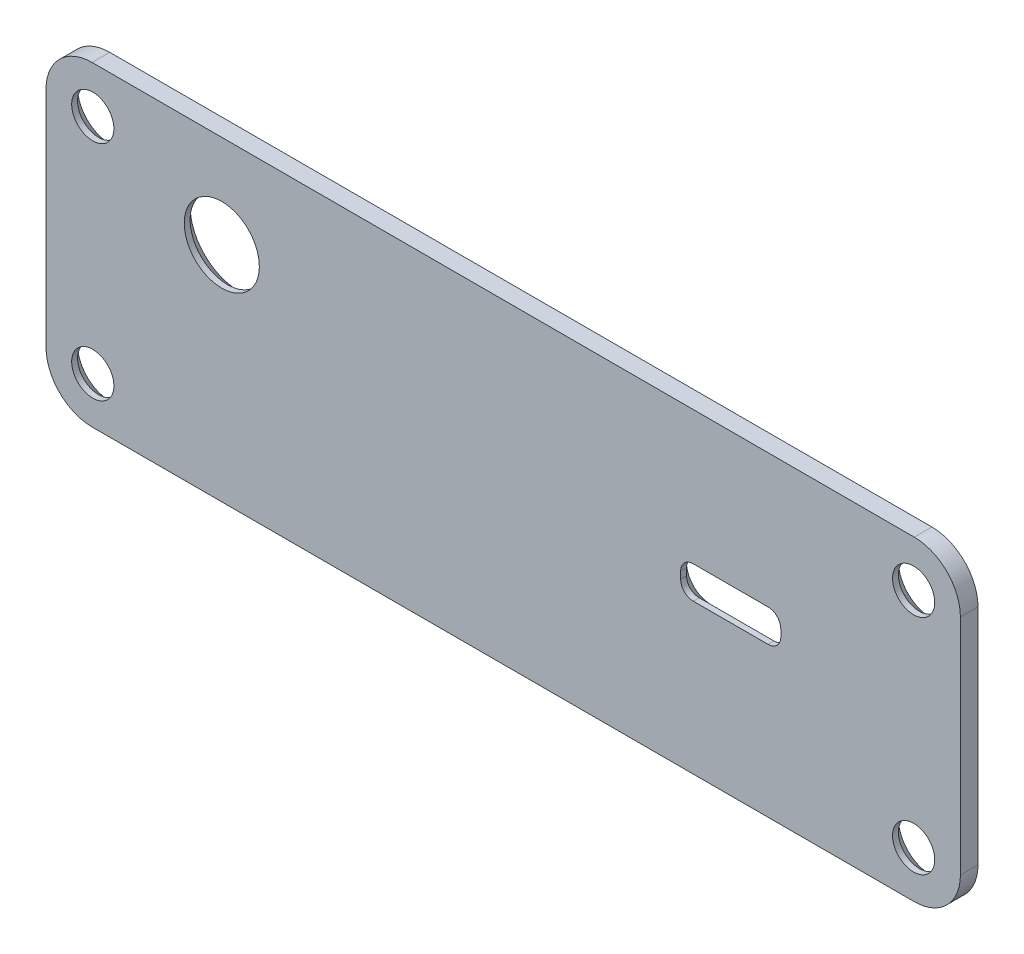
ISO-10303-21;
HEADER;
FILE_DESCRIPTION(('STEP AP214'),'2;1');
FILE_NAME('part.step','',(''),(''),'','','');
FILE_SCHEMA(('AUTOMOTIVE_DESIGN { 1 0 10303 214 1 1 1 1 }'));
ENDSEC;
DATA;
#1=APPLICATION_CONTEXT('core data for automotive mechanical design processes');
#2=APPLICATION_PROTOCOL_DEFINITION('international standard','automotive_design',2000,#1);
#3=PRODUCT_CONTEXT('',#1,'mechanical');
#4=PRODUCT('Part','Part','',(#3));
#5=PRODUCT_RELATED_PRODUCT_CATEGORY('part','',(#4));
#6=PRODUCT_DEFINITION_FORMATION('','',#4);
#7=PRODUCT_DEFINITION_CONTEXT('part definition',#1,'design');
#8=PRODUCT_DEFINITION('design','',#6,#7);
#9=PRODUCT_DEFINITION_SHAPE('','',#8);
#10=(LENGTH_UNIT() NAMED_UNIT(*) SI_UNIT(.MILLI.,.METRE.));
#11=(NAMED_UNIT(*) PLANE_ANGLE_UNIT() SI_UNIT($,.RADIAN.));
#12=(NAMED_UNIT(*) SI_UNIT($,.STERADIAN.) SOLID_ANGLE_UNIT());
#13=UNCERTAINTY_MEASURE_WITH_UNIT(LENGTH_MEASURE(1.E-05),#10,'distance_accuracy_value','');
#14=(GEOMETRIC_REPRESENTATION_CONTEXT(3) GLOBAL_UNCERTAINTY_ASSIGNED_CONTEXT((#13)) GLOBAL_UNIT_ASSIGNED_CONTEXT((#10,
#11,#12)) REPRESENTATION_CONTEXT('',''));
#15=CARTESIAN_POINT('',(0.,0.,0.));
#16=DIRECTION('',(0.,0.,1.));
#17=DIRECTION('',(1.,0.,0.));
#18=AXIS2_PLACEMENT_3D('',#15,#16,#17);
#19=CARTESIAN_POINT('',(3.935,3.935,1.5));
#20=DIRECTION('',(0.,0.,1.));
#21=DIRECTION('',(1.,0.,0.));
#22=AXIS2_PLACEMENT_3D('',#19,#20,#21);
#23=PLANE('',#22);
#24=CARTESIAN_POINT('',(18.1899649689371,18.9844985237211,1.5));
#25=CARTESIAN_POINT('',(18.1899649689371,25.3844985237211,1.5));
#26=CARTESIAN_POINT('',(11.7899649689371,25.3844985237211,1.5));
#27=CARTESIAN_POINT('',(11.7899649689371,18.9844985237211,1.5));
#28=(BOUNDED_CURVE() B_SPLINE_CURVE(3,(#24,#25,#26,#27),.UNSPECIFIED.,.F.,
.F.) B_SPLINE_CURVE_WITH_KNOTS((4,4),(0.,1.),
.UNSPECIFIED.) CURVE() GEOMETRIC_REPRESENTATION_ITEM() RATIONAL_B_SPLINE_CURVE((1.,
0.333333333333333,0.333333333333333,1.)) REPRESENTATION_ITEM(''));
#29=CARTESIAN_POINT('',(18.1899649689371,18.9844985237211,1.5));
#30=VERTEX_POINT('',#29);
#31=CARTESIAN_POINT('',(11.7899649689371,18.9844985237211,1.5));
#32=VERTEX_POINT('',#31);
#33=EDGE_CURVE('E192',#30,#32,#28,.T.);
#34=ORIENTED_EDGE('',*,*,#33,.F.);
#35=CARTESIAN_POINT('',(11.7899649689371,18.9844985237211,1.5));
#36=CARTESIAN_POINT('',(11.7899649689372,12.5844985237211,1.5));
#37=CARTESIAN_POINT('',(18.1899649689372,12.5844985237211,1.5));
#38=CARTESIAN_POINT('',(18.1899649689371,18.9844985237211,1.5));
#39=(BOUNDED_CURVE() B_SPLINE_CURVE(3,(#35,#36,#37,#38),.UNSPECIFIED.,.F.,
.F.) B_SPLINE_CURVE_WITH_KNOTS((4,4),(0.,1.),
.UNSPECIFIED.) CURVE() GEOMETRIC_REPRESENTATION_ITEM() RATIONAL_B_SPLINE_CURVE((1.,
0.333333333333333,0.333333333333333,1.)) REPRESENTATION_ITEM(''));
#40=EDGE_CURVE('E189',#32,#30,#39,.T.);
#41=ORIENTED_EDGE('',*,*,#40,.F.);
#42=EDGE_LOOP('',(#34,#41));
#43=FACE_BOUND('',#42,.T.);
#44=CARTESIAN_POINT('',(62.6599979689345,14.4517998994813,1.5));
#45=CARTESIAN_POINT('',(62.6599980278224,15.0844495776712,1.5));
#46=CARTESIAN_POINT('',(62.2126469944932,15.5318002994689,1.5));
#47=CARTESIAN_POINT('',(61.5799973163036,15.531799800009,1.5));
#48=(BOUNDED_CURVE() B_SPLINE_CURVE(3,(#44,#45,#46,#47),.UNSPECIFIED.,.F.,
.F.) B_SPLINE_CURVE_WITH_KNOTS((4,4),(0.,1.),
.UNSPECIFIED.) CURVE() GEOMETRIC_REPRESENTATION_ITEM() RATIONAL_B_SPLINE_CURVE((1.,
0.804737646104183,0.804737646104183,1.)) REPRESENTATION_ITEM(''));
#49=CARTESIAN_POINT('',(62.6599979689345,14.4517998994813,1.5));
#50=VERTEX_POINT('',#49);
#51=CARTESIAN_POINT('',(61.5799973163035,15.5317999243303,1.5));
#52=VERTEX_POINT('',#51);
#53=EDGE_CURVE('E249',#50,#52,#48,.T.);
#54=ORIENTED_EDGE('',*,*,#53,.F.);
#55=DIRECTION('',(0.,1.,0.));
#56=VECTOR('',#55,1.);
#57=CARTESIAN_POINT('',(62.6599980933165,14.4517998994813,1.5));
#58=LINE('',#57,#56);
#59=CARTESIAN_POINT('',(62.6599980933165,13.8518003725863,1.5));
#60=VERTEX_POINT('',#59);
#61=EDGE_CURVE('E243',#60,#50,#58,.T.);
#62=ORIENTED_EDGE('',*,*,#61,.F.);
#63=CARTESIAN_POINT('',(61.5799973496366,12.7718002000116,1.5));
#64=CARTESIAN_POINT('',(62.2126471387009,12.7717997200776,1.5));
#65=CARTESIAN_POINT('',(62.659998187184,13.2191505835219,1.5));
#66=CARTESIAN_POINT('',(62.6599979689344,13.8518003725863,1.5));
#67=(BOUNDED_CURVE() B_SPLINE_CURVE(3,(#63,#64,#65,#66),.UNSPECIFIED.,.F.,
.F.) B_SPLINE_CURVE_WITH_KNOTS((4,4),(0.,1.),
.UNSPECIFIED.) CURVE() GEOMETRIC_REPRESENTATION_ITEM() RATIONAL_B_SPLINE_CURVE((1.,
0.804737594006537,0.804737594006537,1.)) REPRESENTATION_ITEM(''));
#68=CARTESIAN_POINT('',(61.5799973496366,12.7718002000116,1.5));
#69=VERTEX_POINT('',#68);
#70=EDGE_CURVE('E238',#69,#60,#67,.T.);
#71=ORIENTED_EDGE('',*,*,#70,.F.);
#72=DIRECTION('',(1.,1.15380036878119E-08,0.));
#73=VECTOR('',#72,1.);
#74=CARTESIAN_POINT('',(61.5799973496365,12.7718000594443,1.5));
#75=LINE('',#74,#73);
#76=CARTESIAN_POINT('',(58.6449981689285,12.7718000255803,1.5));
#77=VERTEX_POINT('',#76);
#78=EDGE_CURVE('E235',#77,#69,#75,.T.);
#79=ORIENTED_EDGE('',*,*,#78,.F.);
#80=DIRECTION('',(0.999999999999328,1.1591000728661E-06,0.));
#81=VECTOR('',#80,1.);
#82=CARTESIAN_POINT('',(58.6449981689285,12.7718000255803,1.5));
#83=LINE('',#82,#81);
#84=CARTESIAN_POINT('',(58.6349981689285,12.7718000139893,1.5));
#85=VERTEX_POINT('',#84);
#86=EDGE_CURVE('E233',#85,#77,#83,.T.);
#87=ORIENTED_EDGE('',*,*,#86,.F.);
#88=DIRECTION('',(1.,-2.03317772194214E-09,0.));
#89=VECTOR('',#88,1.);
#90=CARTESIAN_POINT('',(58.6349981689285,12.7718000139893,1.5));
#91=LINE('',#90,#89);
#92=CARTESIAN_POINT('',(55.1999981618515,12.7718000209732,1.5));
#93=VERTEX_POINT('',#92);
#94=EDGE_CURVE('E228',#93,#85,#91,.T.);
#95=ORIENTED_EDGE('',*,*,#94,.F.);
#96=CARTESIAN_POINT('',(54.1199981689366,13.8518005147202,1.5));
#97=CARTESIAN_POINT('',(54.1199978674269,13.2191509263091,1.5));
#98=CARTESIAN_POINT('',(54.5673485734403,12.7718000041615,1.5));
#99=CARTESIAN_POINT('',(55.1999981618515,12.7718000000112,1.5));
#100=(BOUNDED_CURVE() B_SPLINE_CURVE(3,(#96,#97,#98,#99),.UNSPECIFIED.,.F.,
.F.) B_SPLINE_CURVE_WITH_KNOTS((4,4),(0.,1.),
.UNSPECIFIED.) CURVE() GEOMETRIC_REPRESENTATION_ITEM() RATIONAL_B_SPLINE_CURVE((1.,
0.804737743339047,0.804737743339047,1.)) REPRESENTATION_ITEM(''));
#101=CARTESIAN_POINT('',(54.1199981689366,13.8518005147202,1.5));
#102=VERTEX_POINT('',#101);
#103=EDGE_CURVE('E223',#102,#93,#100,.T.);
#104=ORIENTED_EDGE('',*,*,#103,.F.);
#105=DIRECTION('',(0.,-1.,0.));
#106=VECTOR('',#105,1.);
#107=CARTESIAN_POINT('',(54.1199982172505,13.8518005147202,1.5));
#108=LINE('',#107,#106);
#109=CARTESIAN_POINT('',(54.1199982172505,14.4518003250372,1.5));
#110=VERTEX_POINT('',#109);
#111=EDGE_CURVE('E217',#110,#102,#108,.T.);
#112=ORIENTED_EDGE('',*,*,#111,.F.);
#113=CARTESIAN_POINT('',(55.1999996719505,15.5318000000082,1.5));
#114=CARTESIAN_POINT('',(54.5673497721794,15.5318008804542,1.5));
#115=CARTESIAN_POINT('',(54.1199983593337,15.084450224809,1.5));
#116=CARTESIAN_POINT('',(54.1199981689365,14.4518003250372,1.5));
#117=(BOUNDED_CURVE() B_SPLINE_CURVE(3,(#113,#114,#115,#116),.UNSPECIFIED.,.F.,
.F.) B_SPLINE_CURVE_WITH_KNOTS((4,4),(0.,1.),
.UNSPECIFIED.) CURVE() GEOMETRIC_REPRESENTATION_ITEM() RATIONAL_B_SPLINE_CURVE((1.,
0.804737597037281,0.804737597037281,1.)) REPRESENTATION_ITEM(''));
#118=CARTESIAN_POINT('',(55.1999996719505,15.5317999511812,1.5));
#119=VERTEX_POINT('',#118);
#120=EDGE_CURVE('E209',#119,#110,#117,.T.);
#121=ORIENTED_EDGE('',*,*,#120,.F.);
#122=DIRECTION('',(-1.,4.20861173188431E-09,0.));
#123=VECTOR('',#122,1.);
#124=CARTESIAN_POINT('',(55.1999996719505,15.5317999511812,1.5));
#125=LINE('',#124,#123);
#126=EDGE_CURVE('E254',#52,#119,#125,.T.);
#127=ORIENTED_EDGE('',*,*,#126,.F.);
#128=EDGE_LOOP('',(#54,#62,#71,#79,#87,#95,#104,#112,#121,#127));
#129=FACE_BOUND('',#128,.T.);
#130=CARTESIAN_POINT('',(3.98900000000001,3.962,1.5));
#131=DIRECTION('',(0.,0.,1.));
#132=DIRECTION('',(1.,0.,0.));
#133=AXIS2_PLACEMENT_3D('',#130,#131,#132);
#134=CIRCLE('',#133,1.8);
#135=CARTESIAN_POINT('',(5.78900000000001,3.962,1.5));
#136=VERTEX_POINT('',#135);
#137=EDGE_CURVE('E275',#136,#136,#134,.T.);
#138=ORIENTED_EDGE('',*,*,#137,.F.);
#139=EDGE_LOOP('',(#138));
#140=FACE_BOUND('',#139,.T.);
#141=CARTESIAN_POINT('',(3.98900000000001,22.962,1.5));
#142=DIRECTION('',(0.,0.,1.));
#143=DIRECTION('',(1.,0.,0.));
#144=AXIS2_PLACEMENT_3D('',#141,#142,#143);
#145=CIRCLE('',#144,1.8);
#146=CARTESIAN_POINT('',(5.78900000000001,22.962,1.5));
#147=VERTEX_POINT('',#146);
#148=EDGE_CURVE('E281',#147,#147,#145,.T.);
#149=ORIENTED_EDGE('',*,*,#148,.F.);
#150=EDGE_LOOP('',(#149));
#151=FACE_BOUND('',#150,.T.);
#152=CARTESIAN_POINT('',(3.935,3.935,1.5));
#153=DIRECTION('',(0.,0.,1.));
#154=DIRECTION('',(1.,0.,0.));
#155=AXIS2_PLACEMENT_3D('',#152,#153,#154);
#156=CIRCLE('',#155,3.935);
#157=CARTESIAN_POINT('',(0.,3.935,1.5));
#158=VERTEX_POINT('',#157);
#159=CARTESIAN_POINT('',(3.935,0.,1.5));
#160=VERTEX_POINT('',#159);
#161=EDGE_CURVE('E285',#158,#160,#156,.T.);
#162=ORIENTED_EDGE('',*,*,#161,.T.);
#163=DIRECTION('',(1.,0.,0.));
#164=VECTOR('',#163,1.);
#165=CARTESIAN_POINT('',(3.935,0.,1.5));
#166=LINE('',#165,#164);
#167=CARTESIAN_POINT('',(74.043,0.,1.5));
#168=VERTEX_POINT('',#167);
#169=EDGE_CURVE('E288',#160,#168,#166,.T.);
#170=ORIENTED_EDGE('',*,*,#169,.T.);
#171=CARTESIAN_POINT('',(74.043,3.935,1.5));
#172=DIRECTION('',(0.,0.,1.));
#173=DIRECTION('',(1.,0.,0.));
#174=AXIS2_PLACEMENT_3D('',#171,#172,#173);
#175=CIRCLE('',#174,3.93499999999999);
#176=CARTESIAN_POINT('',(77.978,3.935,1.5));
#177=VERTEX_POINT('',#176);
#178=EDGE_CURVE('E291',#168,#177,#175,.T.);
#179=ORIENTED_EDGE('',*,*,#178,.T.);
#180=DIRECTION('',(0.,1.,0.));
#181=VECTOR('',#180,1.);
#182=CARTESIAN_POINT('',(77.978,3.935,1.5));
#183=LINE('',#182,#181);
#184=CARTESIAN_POINT('',(77.978,22.989,1.5));
#185=VERTEX_POINT('',#184);
#186=EDGE_CURVE('E293',#177,#185,#183,.T.);
#187=ORIENTED_EDGE('',*,*,#186,.T.);
#188=CARTESIAN_POINT('',(74.043,22.989,1.5));
#189=DIRECTION('',(0.,0.,1.));
#190=DIRECTION('',(1.,0.,0.));
#191=AXIS2_PLACEMENT_3D('',#188,#189,#190);
#192=CIRCLE('',#191,3.93499999999999);
#193=CARTESIAN_POINT('',(74.043,26.924,1.5));
#194=VERTEX_POINT('',#193);
#195=EDGE_CURVE('E295',#185,#194,#192,.T.);
#196=ORIENTED_EDGE('',*,*,#195,.T.);
#197=DIRECTION('',(-1.,0.,0.));
#198=VECTOR('',#197,1.);
#199=CARTESIAN_POINT('',(74.043,26.924,1.5));
#200=LINE('',#199,#198);
#201=CARTESIAN_POINT('',(3.935,26.924,1.5));
#202=VERTEX_POINT('',#201);
#203=EDGE_CURVE('E297',#194,#202,#200,.T.);
#204=ORIENTED_EDGE('',*,*,#203,.T.);
#205=CARTESIAN_POINT('',(3.93500000000001,22.989,1.5));
#206=DIRECTION('',(0.,0.,1.));
#207=DIRECTION('',(1.,0.,0.));
#208=AXIS2_PLACEMENT_3D('',#205,#206,#207);
#209=CIRCLE('',#208,3.93499999999999);
#210=CARTESIAN_POINT('',(0.,22.989,1.5));
#211=VERTEX_POINT('',#210);
#212=EDGE_CURVE('E299',#202,#211,#209,.T.);
#213=ORIENTED_EDGE('',*,*,#212,.T.);
#214=DIRECTION('',(0.,-1.,0.));
#215=VECTOR('',#214,1.);
#216=CARTESIAN_POINT('',(0.,22.989,1.5));
#217=LINE('',#216,#215);
#218=EDGE_CURVE('E301',#211,#158,#217,.T.);
#219=ORIENTED_EDGE('',*,*,#218,.T.);
#220=EDGE_LOOP('',(#162,#170,#179,#187,#196,#204,#213,#219));
#221=FACE_BOUND('',#220,.T.);
#222=CARTESIAN_POINT('',(73.989,22.962,1.5));
#223=DIRECTION('',(0.,0.,1.));
#224=DIRECTION('',(1.,0.,0.));
#225=AXIS2_PLACEMENT_3D('',#222,#223,#224);
#226=CIRCLE('',#225,1.79999999999999);
#227=CARTESIAN_POINT('',(75.789,22.962,1.5));
#228=VERTEX_POINT('',#227);
#229=EDGE_CURVE('E278',#228,#228,#226,.T.);
#230=ORIENTED_EDGE('',*,*,#229,.F.);
#231=EDGE_LOOP('',(#230));
#232=FACE_BOUND('',#231,.T.);
#233=CARTESIAN_POINT('',(73.989,3.96199999999999,1.5));
#234=DIRECTION('',(0.,0.,1.));
#235=DIRECTION('',(1.,0.,0.));
#236=AXIS2_PLACEMENT_3D('',#233,#234,#235);
#237=CIRCLE('',#236,1.79999999999999);
#238=CARTESIAN_POINT('',(75.789,3.96199999999999,1.5));
#239=VERTEX_POINT('',#238);
#240=EDGE_CURVE('E194',#239,#239,#237,.T.);
#241=ORIENTED_EDGE('',*,*,#240,.F.);
#242=EDGE_LOOP('',(#241));
#243=FACE_BOUND('',#242,.T.);
#244=ADVANCED_FACE('F37',(#43,#129,#140,#151,#221,#232,#243),#23,.T.);
#245=CARTESIAN_POINT('',(3.935,3.935,0.));
#246=DIRECTION('',(0.,0.,1.));
#247=DIRECTION('',(1.,0.,0.));
#248=AXIS2_PLACEMENT_3D('',#245,#246,#247);
#249=PLANE('',#248);
#250=CARTESIAN_POINT('',(14.9899649689371,18.9844985237211,0.));
#251=DIRECTION('',(0.,0.,1.));
#252=DIRECTION('',(1.,0.,0.));
#253=AXIS2_PLACEMENT_3D('',#250,#251,#252);
#254=CIRCLE('',#253,4.2);
#255=CARTESIAN_POINT('',(19.1899649689371,18.9844985237211,0.));
#256=VERTEX_POINT('',#255);
#257=EDGE_CURVE('E371',#256,#256,#254,.T.);
#258=ORIENTED_EDGE('',*,*,#257,.T.);
#259=EDGE_LOOP('',(#258));
#260=FACE_BOUND('',#259,.T.);
#261=CARTESIAN_POINT('',(61.5799981689345,14.4518000000093,0.));
#262=DIRECTION('',(0.,0.,1.));
#263=DIRECTION('',(1.,0.,0.));
#264=AXIS2_PLACEMENT_3D('',#261,#262,#263);
#265=CIRCLE('',#264,2.07999980000001);
#266=CARTESIAN_POINT('',(63.6599980933165,14.4517998063998,0.));
#267=VERTEX_POINT('',#266);
#268=CARTESIAN_POINT('',(61.5799973205121,16.5317998000091,0.));
#269=VERTEX_POINT('',#268);
#270=EDGE_CURVE('E364',#267,#269,#265,.T.);
#271=ORIENTED_EDGE('',*,*,#270,.T.);
#272=DIRECTION('',(-1.,4.20861173188431E-09,0.));
#273=VECTOR('',#272,1.);
#274=CARTESIAN_POINT('',(3.93500005301504,16.5318001669357,0.));
#275=LINE('',#274,#273);
#276=CARTESIAN_POINT('',(55.1999996761591,16.5318000000087,0.));
#277=VERTEX_POINT('',#276);
#278=EDGE_CURVE('E368',#269,#277,#275,.T.);
#279=ORIENTED_EDGE('',*,*,#278,.T.);
#280=CARTESIAN_POINT('',(55.1999981689365,14.4518000000092,0.));
#281=DIRECTION('',(0.,0.,1.));
#282=DIRECTION('',(1.,0.,0.));
#283=AXIS2_PLACEMENT_3D('',#280,#281,#282);
#284=CIRCLE('',#283,2.08);
#285=CARTESIAN_POINT('',(53.1199982172505,14.4518006259891,0.));
#286=VERTEX_POINT('',#285);
#287=EDGE_CURVE('E366',#277,#286,#284,.T.);
#288=ORIENTED_EDGE('',*,*,#287,.T.);
#289=DIRECTION('',(0.,-1.,0.));
#290=VECTOR('',#289,1.);
#291=CARTESIAN_POINT('',(53.1199982172506,3.93500000000057,0.));
#292=LINE('',#291,#290);
#293=CARTESIAN_POINT('',(53.1199981689365,13.8518005147202,0.));
#294=VERTEX_POINT('',#293);
#295=EDGE_CURVE('E362',#286,#294,#292,.T.);
#296=ORIENTED_EDGE('',*,*,#295,.T.);
#297=CARTESIAN_POINT('',(55.1999981689365,13.8518000000112,0.));
#298=DIRECTION('',(0.,0.,1.));
#299=DIRECTION('',(1.,0.,0.));
#300=AXIS2_PLACEMENT_3D('',#297,#298,#299);
#301=CIRCLE('',#300,2.08000000000001);
#302=CARTESIAN_POINT('',(55.1999981552913,11.7717999858318,0.));
#303=VERTEX_POINT('',#302);
#304=EDGE_CURVE('E358',#294,#303,#301,.T.);
#305=ORIENTED_EDGE('',*,*,#304,.T.);
#306=DIRECTION('',(1.,1.15380036878119E-08,0.));
#307=VECTOR('',#306,1.);
#308=CARTESIAN_POINT('',(3.93499990957898,11.7717993943361,0.));
#309=LINE('',#308,#307);
#310=CARTESIAN_POINT('',(61.5799965910273,11.7718000594443,0.));
#311=VERTEX_POINT('',#310);
#312=EDGE_CURVE('E354',#303,#311,#309,.T.);
#313=ORIENTED_EDGE('',*,*,#312,.T.);
#314=CARTESIAN_POINT('',(61.5799981689345,13.8518000000113,0.));
#315=DIRECTION('',(0.,0.,1.));
#316=DIRECTION('',(1.,0.,0.));
#317=AXIS2_PLACEMENT_3D('',#314,#315,#316);
#318=CIRCLE('',#317,2.0799998);
#319=CARTESIAN_POINT('',(63.6599979689345,13.8518003725863,0.));
#320=VERTEX_POINT('',#319);
#321=EDGE_CURVE('E356',#311,#320,#318,.T.);
#322=ORIENTED_EDGE('',*,*,#321,.T.);
#323=DIRECTION('',(0.,1.,0.));
#324=VECTOR('',#323,1.);
#325=CARTESIAN_POINT('',(63.6599980933165,3.935,0.));
#326=LINE('',#325,#324);
#327=EDGE_CURVE('E360',#320,#267,#326,.T.);
#328=ORIENTED_EDGE('',*,*,#327,.T.);
#329=EDGE_LOOP('',(#271,#279,#288,#296,#305,#313,#322,#328));
#330=FACE_BOUND('',#329,.T.);
#331=CARTESIAN_POINT('',(73.989,22.962,0.));
#332=DIRECTION('',(0.,0.,1.));
#333=DIRECTION('',(1.,0.,0.));
#334=AXIS2_PLACEMENT_3D('',#331,#332,#333);
#335=CIRCLE('',#334,2.80000000000002);
#336=CARTESIAN_POINT('',(76.789,22.962,0.));
#337=VERTEX_POINT('',#336);
#338=EDGE_CURVE('E351',#337,#337,#335,.T.);
#339=ORIENTED_EDGE('',*,*,#338,.T.);
#340=EDGE_LOOP('',(#339));
#341=FACE_BOUND('',#340,.T.);
#342=CARTESIAN_POINT('',(73.989,3.96199999999999,0.));
#343=DIRECTION('',(0.,0.,1.));
#344=DIRECTION('',(1.,0.,0.));
#345=AXIS2_PLACEMENT_3D('',#342,#343,#344);
#346=CIRCLE('',#345,2.80000000000002);
#347=CARTESIAN_POINT('',(76.789,3.96199999999999,0.));
#348=VERTEX_POINT('',#347);
#349=EDGE_CURVE('E348',#348,#348,#346,.T.);
#350=ORIENTED_EDGE('',*,*,#349,.T.);
#351=EDGE_LOOP('',(#350));
#352=FACE_BOUND('',#351,.T.);
#353=CARTESIAN_POINT('',(3.98900000000001,22.962,0.));
#354=DIRECTION('',(0.,0.,1.));
#355=DIRECTION('',(1.,0.,0.));
#356=AXIS2_PLACEMENT_3D('',#353,#354,#355);
#357=CIRCLE('',#356,2.79999999999999);
#358=CARTESIAN_POINT('',(6.789,22.962,0.));
#359=VERTEX_POINT('',#358);
#360=EDGE_CURVE('E345',#359,#359,#357,.T.);
#361=ORIENTED_EDGE('',*,*,#360,.T.);
#362=EDGE_LOOP('',(#361));
#363=FACE_BOUND('',#362,.T.);
#364=CARTESIAN_POINT('',(3.98900000000001,3.962,0.));
#365=DIRECTION('',(0.,0.,1.));
#366=DIRECTION('',(1.,0.,0.));
#367=AXIS2_PLACEMENT_3D('',#364,#365,#366);
#368=CIRCLE('',#367,2.80000000000001);
#369=CARTESIAN_POINT('',(6.78900000000002,3.962,0.));
#370=VERTEX_POINT('',#369);
#371=EDGE_CURVE('E342',#370,#370,#368,.T.);
#372=ORIENTED_EDGE('',*,*,#371,.T.);
#373=EDGE_LOOP('',(#372));
#374=FACE_BOUND('',#373,.T.);
#375=CARTESIAN_POINT('',(3.935,3.935,0.));
#376=DIRECTION('',(0.,0.,1.));
#377=DIRECTION('',(1.,0.,0.));
#378=AXIS2_PLACEMENT_3D('',#375,#376,#377);
#379=CIRCLE('',#378,3.935);
#380=CARTESIAN_POINT('',(0.,3.935,0.));
#381=VERTEX_POINT('',#380);
#382=CARTESIAN_POINT('',(3.935,0.,0.));
#383=VERTEX_POINT('',#382);
#384=EDGE_CURVE('E284',#381,#383,#379,.T.);
#385=ORIENTED_EDGE('',*,*,#384,.F.);
#386=DIRECTION('',(0.,-1.,0.));
#387=VECTOR('',#386,1.);
#388=CARTESIAN_POINT('',(0.,22.989,0.));
#389=LINE('',#388,#387);
#390=CARTESIAN_POINT('',(0.,22.989,0.));
#391=VERTEX_POINT('',#390);
#392=EDGE_CURVE('E289',#391,#381,#389,.T.);
#393=ORIENTED_EDGE('',*,*,#392,.F.);
#394=CARTESIAN_POINT('',(3.93500000000001,22.989,0.));
#395=DIRECTION('',(0.,0.,1.));
#396=DIRECTION('',(1.,0.,0.));
#397=AXIS2_PLACEMENT_3D('',#394,#395,#396);
#398=CIRCLE('',#397,3.93499999999999);
#399=CARTESIAN_POINT('',(3.935,26.924,0.));
#400=VERTEX_POINT('',#399);
#401=EDGE_CURVE('E316',#400,#391,#398,.T.);
#402=ORIENTED_EDGE('',*,*,#401,.F.);
#403=DIRECTION('',(-1.,0.,0.));
#404=VECTOR('',#403,1.);
#405=CARTESIAN_POINT('',(74.043,26.924,0.));
#406=LINE('',#405,#404);
#407=CARTESIAN_POINT('',(74.043,26.924,0.));
#408=VERTEX_POINT('',#407);
#409=EDGE_CURVE('E314',#408,#400,#406,.T.);
#410=ORIENTED_EDGE('',*,*,#409,.F.);
#411=CARTESIAN_POINT('',(74.043,22.989,0.));
#412=DIRECTION('',(0.,0.,1.));
#413=DIRECTION('',(1.,0.,0.));
#414=AXIS2_PLACEMENT_3D('',#411,#412,#413);
#415=CIRCLE('',#414,3.93499999999999);
#416=CARTESIAN_POINT('',(77.978,22.989,0.));
#417=VERTEX_POINT('',#416);
#418=EDGE_CURVE('E312',#417,#408,#415,.T.);
#419=ORIENTED_EDGE('',*,*,#418,.F.);
#420=DIRECTION('',(0.,1.,0.));
#421=VECTOR('',#420,1.);
#422=CARTESIAN_POINT('',(77.978,3.935,0.));
#423=LINE('',#422,#421);
#424=CARTESIAN_POINT('',(77.978,3.935,0.));
#425=VERTEX_POINT('',#424);
#426=EDGE_CURVE('E310',#425,#417,#423,.T.);
#427=ORIENTED_EDGE('',*,*,#426,.F.);
#428=CARTESIAN_POINT('',(74.043,3.935,0.));
#429=DIRECTION('',(0.,0.,1.));
#430=DIRECTION('',(1.,0.,0.));
#431=AXIS2_PLACEMENT_3D('',#428,#429,#430);
#432=CIRCLE('',#431,3.93499999999999);
#433=CARTESIAN_POINT('',(74.043,0.,0.));
#434=VERTEX_POINT('',#433);
#435=EDGE_CURVE('E308',#434,#425,#432,.T.);
#436=ORIENTED_EDGE('',*,*,#435,.F.);
#437=DIRECTION('',(1.,0.,0.));
#438=VECTOR('',#437,1.);
#439=CARTESIAN_POINT('',(3.935,0.,0.));
#440=LINE('',#439,#438);
#441=EDGE_CURVE('E306',#383,#434,#440,.T.);
#442=ORIENTED_EDGE('',*,*,#441,.F.);
#443=EDGE_LOOP('',(#385,#393,#402,#410,#419,#427,#436,#442));
#444=FACE_BOUND('',#443,.T.);
#445=ADVANCED_FACE('F466',(#260,#330,#341,#352,#363,#374,#444),#249,.F.);
#446=CARTESIAN_POINT('',(3.935,3.935,1.5));
#447=DIRECTION('',(0.,0.,-1.));
#448=DIRECTION('',(-1.,0.,0.));
#449=AXIS2_PLACEMENT_3D('',#446,#447,#448);
#450=CYLINDRICAL_SURFACE('',#449,3.935);
#451=ORIENTED_EDGE('',*,*,#384,.T.);
#452=DIRECTION('',(0.,0.,-1.));
#453=VECTOR('',#452,1.);
#454=CARTESIAN_POINT('',(3.935,0.,1.5));
#455=LINE('',#454,#453);
#456=EDGE_CURVE('E339',#160,#383,#455,.T.);
#457=ORIENTED_EDGE('',*,*,#456,.F.);
#458=ORIENTED_EDGE('',*,*,#161,.F.);
#459=DIRECTION('',(0.,0.,-1.));
#460=VECTOR('',#459,1.);
#461=CARTESIAN_POINT('',(0.,3.935,1.5));
#462=LINE('',#461,#460);
#463=EDGE_CURVE('E303',#158,#381,#462,.T.);
#464=ORIENTED_EDGE('',*,*,#463,.T.);
#465=EDGE_LOOP('',(#451,#457,#458,#464));
#466=FACE_BOUND('',#465,.T.);
#467=ADVANCED_FACE('F505',(#466),#450,.T.);
#468=CARTESIAN_POINT('',(3.935,0.,1.5));
#469=DIRECTION('',(0.,1.,0.));
#470=DIRECTION('',(-1.,0.,0.));
#471=AXIS2_PLACEMENT_3D('',#468,#469,#470);
#472=PLANE('',#471);
#473=ORIENTED_EDGE('',*,*,#441,.T.);
#474=DIRECTION('',(0.,0.,-1.));
#475=VECTOR('',#474,1.);
#476=CARTESIAN_POINT('',(74.043,0.,1.5));
#477=LINE('',#476,#475);
#478=EDGE_CURVE('E336',#168,#434,#477,.T.);
#479=ORIENTED_EDGE('',*,*,#478,.F.);
#480=ORIENTED_EDGE('',*,*,#169,.F.);
#481=ORIENTED_EDGE('',*,*,#456,.T.);
#482=EDGE_LOOP('',(#473,#479,#480,#481));
#483=FACE_BOUND('',#482,.T.);
#484=ADVANCED_FACE('F535',(#483),#472,.F.);
#485=CARTESIAN_POINT('',(74.043,3.935,1.5));
#486=DIRECTION('',(0.,0.,-1.));
#487=DIRECTION('',(-1.,0.,0.));
#488=AXIS2_PLACEMENT_3D('',#485,#486,#487);
#489=CYLINDRICAL_SURFACE('',#488,3.93499999999999);
#490=ORIENTED_EDGE('',*,*,#435,.T.);
#491=DIRECTION('',(0.,0.,-1.));
#492=VECTOR('',#491,1.);
#493=CARTESIAN_POINT('',(77.978,3.935,1.5));
#494=LINE('',#493,#492);
#495=EDGE_CURVE('E333',#177,#425,#494,.T.);
#496=ORIENTED_EDGE('',*,*,#495,.F.);
#497=ORIENTED_EDGE('',*,*,#178,.F.);
#498=ORIENTED_EDGE('',*,*,#478,.T.);
#499=EDGE_LOOP('',(#490,#496,#497,#498));
#500=FACE_BOUND('',#499,.T.);
#501=ADVANCED_FACE('F531',(#500),#489,.T.);
#502=CARTESIAN_POINT('',(77.978,3.935,1.5));
#503=DIRECTION('',(-1.,0.,0.));
#504=DIRECTION('',(0.,0.,1.));
#505=AXIS2_PLACEMENT_3D('',#502,#503,#504);
#506=PLANE('',#505);
#507=ORIENTED_EDGE('',*,*,#426,.T.);
#508=DIRECTION('',(0.,0.,-1.));
#509=VECTOR('',#508,1.);
#510=CARTESIAN_POINT('',(77.978,22.989,1.5));
#511=LINE('',#510,#509);
#512=EDGE_CURVE('E330',#185,#417,#511,.T.);
#513=ORIENTED_EDGE('',*,*,#512,.F.);
#514=ORIENTED_EDGE('',*,*,#186,.F.);
#515=ORIENTED_EDGE('',*,*,#495,.T.);
#516=EDGE_LOOP('',(#507,#513,#514,#515));
#517=FACE_BOUND('',#516,.T.);
#518=ADVANCED_FACE('F527',(#517),#506,.F.);
#519=CARTESIAN_POINT('',(74.043,22.989,1.5));
#520=DIRECTION('',(0.,0.,-1.));
#521=DIRECTION('',(-1.,0.,0.));
#522=AXIS2_PLACEMENT_3D('',#519,#520,#521);
#523=CYLINDRICAL_SURFACE('',#522,3.93499999999999);
#524=ORIENTED_EDGE('',*,*,#418,.T.);
#525=DIRECTION('',(0.,0.,-1.));
#526=VECTOR('',#525,1.);
#527=CARTESIAN_POINT('',(74.043,26.924,1.5));
#528=LINE('',#527,#526);
#529=EDGE_CURVE('E327',#194,#408,#528,.T.);
#530=ORIENTED_EDGE('',*,*,#529,.F.);
#531=ORIENTED_EDGE('',*,*,#195,.F.);
#532=ORIENTED_EDGE('',*,*,#512,.T.);
#533=EDGE_LOOP('',(#524,#530,#531,#532));
#534=FACE_BOUND('',#533,.T.);
#535=ADVANCED_FACE('F523',(#534),#523,.T.);
#536=CARTESIAN_POINT('',(74.043,26.924,1.5));
#537=DIRECTION('',(0.,-1.,0.));
#538=DIRECTION('',(0.,0.,-1.));
#539=AXIS2_PLACEMENT_3D('',#536,#537,#538);
#540=PLANE('',#539);
#541=ORIENTED_EDGE('',*,*,#409,.T.);
#542=DIRECTION('',(0.,0.,-1.));
#543=VECTOR('',#542,1.);
#544=CARTESIAN_POINT('',(3.935,26.924,1.5));
#545=LINE('',#544,#543);
#546=EDGE_CURVE('E324',#202,#400,#545,.T.);
#547=ORIENTED_EDGE('',*,*,#546,.F.);
#548=ORIENTED_EDGE('',*,*,#203,.F.);
#549=ORIENTED_EDGE('',*,*,#529,.T.);
#550=EDGE_LOOP('',(#541,#547,#548,#549));
#551=FACE_BOUND('',#550,.T.);
#552=ADVANCED_FACE('F519',(#551),#540,.F.);
#553=CARTESIAN_POINT('',(3.93500000000001,22.989,1.5));
#554=DIRECTION('',(0.,0.,-1.));
#555=DIRECTION('',(-1.,0.,0.));
#556=AXIS2_PLACEMENT_3D('',#553,#554,#555);
#557=CYLINDRICAL_SURFACE('',#556,3.93499999999999);
#558=ORIENTED_EDGE('',*,*,#401,.T.);
#559=DIRECTION('',(0.,0.,-1.));
#560=VECTOR('',#559,1.);
#561=CARTESIAN_POINT('',(0.,22.989,1.5));
#562=LINE('',#561,#560);
#563=EDGE_CURVE('E321',#211,#391,#562,.T.);
#564=ORIENTED_EDGE('',*,*,#563,.F.);
#565=ORIENTED_EDGE('',*,*,#212,.F.);
#566=ORIENTED_EDGE('',*,*,#546,.T.);
#567=EDGE_LOOP('',(#558,#564,#565,#566));
#568=FACE_BOUND('',#567,.T.);
#569=ADVANCED_FACE('F515',(#568),#557,.T.);
#570=CARTESIAN_POINT('',(0.,22.989,1.5));
#571=DIRECTION('',(1.,0.,0.));
#572=DIRECTION('',(0.,1.,0.));
#573=AXIS2_PLACEMENT_3D('',#570,#571,#572);
#574=PLANE('',#573);
#575=ORIENTED_EDGE('',*,*,#392,.T.);
#576=ORIENTED_EDGE('',*,*,#463,.F.);
#577=ORIENTED_EDGE('',*,*,#218,.F.);
#578=ORIENTED_EDGE('',*,*,#563,.T.);
#579=EDGE_LOOP('',(#575,#576,#577,#578));
#580=FACE_BOUND('',#579,.T.);
#581=ADVANCED_FACE('F512',(#580),#574,.F.);
#582=CARTESIAN_POINT('',(3.98900000000001,22.962,1.5));
#583=DIRECTION('',(0.,0.,-1.));
#584=DIRECTION('',(-1.,0.,0.));
#585=AXIS2_PLACEMENT_3D('',#582,#583,#584);
#586=CYLINDRICAL_SURFACE('',#585,1.8);
#587=CARTESIAN_POINT('',(3.98900000000001,22.962,0.99999999999999));
#588=DIRECTION('',(0.,0.,1.));
#589=DIRECTION('',(1.,0.,0.));
#590=AXIS2_PLACEMENT_3D('',#587,#588,#589);
#591=CIRCLE('',#590,1.8);
#592=CARTESIAN_POINT('',(5.78900000000001,22.962,0.99999999999999));
#593=VERTEX_POINT('',#592);
#594=EDGE_CURVE('E47',#593,#593,#591,.F.);
#595=ORIENTED_EDGE('',*,*,#594,.T.);
#596=EDGE_LOOP('',(#595));
#597=FACE_BOUND('',#596,.T.);
#598=ORIENTED_EDGE('',*,*,#148,.T.);
#599=EDGE_LOOP('',(#598));
#600=FACE_BOUND('',#599,.T.);
#601=ADVANCED_FACE('F509',(#597,#600),#586,.F.);
#602=CARTESIAN_POINT('',(73.989,22.962,1.5));
#603=DIRECTION('',(0.,0.,-1.));
#604=DIRECTION('',(-1.,0.,0.));
#605=AXIS2_PLACEMENT_3D('',#602,#603,#604);
#606=CYLINDRICAL_SURFACE('',#605,1.79999999999999);
#607=CARTESIAN_POINT('',(73.989,22.962,1.00000000000002));
#608=DIRECTION('',(0.,0.,1.));
#609=DIRECTION('',(1.,0.,0.));
#610=AXIS2_PLACEMENT_3D('',#607,#608,#609);
#611=CIRCLE('',#610,1.79999999999999);
#612=CARTESIAN_POINT('',(75.789,22.962,1.00000000000002));
#613=VERTEX_POINT('',#612);
#614=EDGE_CURVE('E392',#613,#613,#611,.F.);
#615=ORIENTED_EDGE('',*,*,#614,.T.);
#616=EDGE_LOOP('',(#615));
#617=FACE_BOUND('',#616,.T.);
#618=ORIENTED_EDGE('',*,*,#229,.T.);
#619=EDGE_LOOP('',(#618));
#620=FACE_BOUND('',#619,.T.);
#621=ADVANCED_FACE('F586',(#617,#620),#606,.F.);
#622=CARTESIAN_POINT('',(3.98900000000001,3.962,1.5));
#623=DIRECTION('',(0.,0.,-1.));
#624=DIRECTION('',(-1.,0.,0.));
#625=AXIS2_PLACEMENT_3D('',#622,#623,#624);
#626=CYLINDRICAL_SURFACE('',#625,1.8);
#627=CARTESIAN_POINT('',(3.98900000000001,3.962,1.00000000000001));
#628=DIRECTION('',(0.,0.,1.));
#629=DIRECTION('',(1.,0.,0.));
#630=AXIS2_PLACEMENT_3D('',#627,#628,#629);
#631=CIRCLE('',#630,1.8);
#632=CARTESIAN_POINT('',(5.78900000000001,3.962,1.00000000000001));
#633=VERTEX_POINT('',#632);
#634=EDGE_CURVE('E11',#633,#633,#631,.F.);
#635=ORIENTED_EDGE('',*,*,#634,.T.);
#636=EDGE_LOOP('',(#635));
#637=FACE_BOUND('',#636,.T.);
#638=ORIENTED_EDGE('',*,*,#137,.T.);
#639=EDGE_LOOP('',(#638));
#640=FACE_BOUND('',#639,.T.);
#641=ADVANCED_FACE('F583',(#637,#640),#626,.F.);
#642=CARTESIAN_POINT('',(73.989,3.96199999999999,1.5));
#643=DIRECTION('',(0.,0.,-1.));
#644=DIRECTION('',(-1.,0.,0.));
#645=AXIS2_PLACEMENT_3D('',#642,#643,#644);
#646=CYLINDRICAL_SURFACE('',#645,1.79999999999999);
#647=CARTESIAN_POINT('',(73.989,3.96199999999999,1.00000000000002));
#648=DIRECTION('',(0.,0.,1.));
#649=DIRECTION('',(1.,0.,0.));
#650=AXIS2_PLACEMENT_3D('',#647,#648,#649);
#651=CIRCLE('',#650,1.79999999999999);
#652=CARTESIAN_POINT('',(75.789,3.96199999999999,1.00000000000002));
#653=VERTEX_POINT('',#652);
#654=EDGE_CURVE('E395',#653,#653,#651,.F.);
#655=ORIENTED_EDGE('',*,*,#654,.T.);
#656=EDGE_LOOP('',(#655));
#657=FACE_BOUND('',#656,.T.);
#658=ORIENTED_EDGE('',*,*,#240,.T.);
#659=EDGE_LOOP('',(#658));
#660=FACE_BOUND('',#659,.T.);
#661=ADVANCED_FACE('F580',(#657,#660),#646,.F.);
#662=CARTESIAN_POINT('',(55.1999981689365,14.4518000000092,-8.5));
#663=DIRECTION('',(0.,0.,1.));
#664=DIRECTION('',(1.,0.,0.));
#665=AXIS2_PLACEMENT_3D('',#662,#663,#664);
#666=CYLINDRICAL_SURFACE('',#665,1.07999999999999);
#667=DIRECTION('',(0.,0.,1.));
#668=VECTOR('',#667,1.);
#669=CARTESIAN_POINT('',(54.1199982172505,14.4518003250372,-8.5));
#670=LINE('',#669,#668);
#671=CARTESIAN_POINT('',(54.1199982172505,14.4518003250372,1.00000000000001));
#672=VERTEX_POINT('',#671);
#673=EDGE_CURVE('E259',#672,#110,#670,.T.);
#674=ORIENTED_EDGE('',*,*,#673,.F.);
#675=CARTESIAN_POINT('',(55.1999981689365,14.4518000000092,1.00000000000001));
#676=DIRECTION('',(0.,0.,1.));
#677=DIRECTION('',(1.,0.,0.));
#678=AXIS2_PLACEMENT_3D('',#675,#676,#677);
#679=CIRCLE('',#678,1.07999999999999);
#680=CARTESIAN_POINT('',(55.1999996719505,15.5317999511812,1.00000000000001));
#681=VERTEX_POINT('',#680);
#682=EDGE_CURVE('E380',#672,#681,#679,.F.);
#683=ORIENTED_EDGE('',*,*,#682,.T.);
#684=DIRECTION('',(0.,0.,1.));
#685=VECTOR('',#684,1.);
#686=CARTESIAN_POINT('',(55.1999996719505,15.5317999511812,-8.5));
#687=LINE('',#686,#685);
#688=EDGE_CURVE('E197',#681,#119,#687,.T.);
#689=ORIENTED_EDGE('',*,*,#688,.T.);
#690=ORIENTED_EDGE('',*,*,#120,.T.);
#691=EDGE_LOOP('',(#674,#683,#689,#690));
#692=FACE_BOUND('',#691,.T.);
#693=ADVANCED_FACE('F479',(#692),#666,.F.);
#694=CARTESIAN_POINT('',(55.1999996719505,15.5317999511812,-8.5));
#695=DIRECTION('',(4.20861173188431E-09,1.,0.));
#696=DIRECTION('',(-1.,4.20861173188431E-09,0.));
#697=AXIS2_PLACEMENT_3D('',#694,#695,#696);
#698=PLANE('',#697);
#699=ORIENTED_EDGE('',*,*,#688,.F.);
#700=DIRECTION('',(1.,-4.20861173188431E-09,0.));
#701=VECTOR('',#700,1.);
#702=CARTESIAN_POINT('',(55.1999996719505,15.5317999511812,1.00000000000001));
#703=LINE('',#702,#701);
#704=CARTESIAN_POINT('',(61.5799973163035,15.5317999243303,1.00000000000001));
#705=VERTEX_POINT('',#704);
#706=EDGE_CURVE('E377',#681,#705,#703,.T.);
#707=ORIENTED_EDGE('',*,*,#706,.T.);
#708=DIRECTION('',(0.,0.,1.));
#709=VECTOR('',#708,1.);
#710=CARTESIAN_POINT('',(61.5799973163035,15.5317999243303,-8.5));
#711=LINE('',#710,#709);
#712=EDGE_CURVE('E199',#705,#52,#711,.T.);
#713=ORIENTED_EDGE('',*,*,#712,.T.);
#714=ORIENTED_EDGE('',*,*,#126,.T.);
#715=EDGE_LOOP('',(#699,#707,#713,#714));
#716=FACE_BOUND('',#715,.T.);
#717=ADVANCED_FACE('F482',(#716),#698,.F.);
#718=CARTESIAN_POINT('',(61.5799981689345,14.4518000000093,-8.5));
#719=DIRECTION('',(0.,0.,1.));
#720=DIRECTION('',(1.,0.,0.));
#721=AXIS2_PLACEMENT_3D('',#718,#719,#720);
#722=CYLINDRICAL_SURFACE('',#721,1.07999980000001);
#723=ORIENTED_EDGE('',*,*,#712,.F.);
#724=CARTESIAN_POINT('',(61.5799981689345,14.4518000000093,1.00000000000001));
#725=DIRECTION('',(0.,0.,1.));
#726=DIRECTION('',(1.,0.,0.));
#727=AXIS2_PLACEMENT_3D('',#724,#725,#726);
#728=CIRCLE('',#727,1.07999980000001);
#729=CARTESIAN_POINT('',(62.6599979689345,14.4517998994813,1.00000000000001));
#730=VERTEX_POINT('',#729);
#731=EDGE_CURVE('E382',#705,#730,#728,.F.);
#732=ORIENTED_EDGE('',*,*,#731,.T.);
#733=DIRECTION('',(0.,0.,1.));
#734=VECTOR('',#733,1.);
#735=CARTESIAN_POINT('',(62.6599979689345,14.4517998994813,-8.5));
#736=LINE('',#735,#734);
#737=EDGE_CURVE('E262',#730,#50,#736,.T.);
#738=ORIENTED_EDGE('',*,*,#737,.T.);
#739=ORIENTED_EDGE('',*,*,#53,.T.);
#740=EDGE_LOOP('',(#723,#732,#738,#739));
#741=FACE_BOUND('',#740,.T.);
#742=ADVANCED_FACE('F566',(#741),#722,.F.);
#743=CARTESIAN_POINT('',(62.6599980933165,14.4517998994813,-8.5));
#744=DIRECTION('',(1.,0.,0.));
#745=DIRECTION('',(0.,0.,-1.));
#746=AXIS2_PLACEMENT_3D('',#743,#744,#745);
#747=PLANE('',#746);
#748=ORIENTED_EDGE('',*,*,#737,.F.);
#749=DIRECTION('',(0.,-1.,0.));
#750=VECTOR('',#749,1.);
#751=CARTESIAN_POINT('',(62.6599980933165,14.4517998994813,1.00000000000001));
#752=LINE('',#751,#750);
#753=CARTESIAN_POINT('',(62.6599980933165,13.8518003725863,1.00000000000001));
#754=VERTEX_POINT('',#753);
#755=EDGE_CURVE('E386',#730,#754,#752,.T.);
#756=ORIENTED_EDGE('',*,*,#755,.T.);
#757=DIRECTION('',(0.,0.,1.));
#758=VECTOR('',#757,1.);
#759=CARTESIAN_POINT('',(62.6599980933165,13.8518003725863,-8.5));
#760=LINE('',#759,#758);
#761=EDGE_CURVE('E264',#754,#60,#760,.T.);
#762=ORIENTED_EDGE('',*,*,#761,.T.);
#763=ORIENTED_EDGE('',*,*,#61,.T.);
#764=EDGE_LOOP('',(#748,#756,#762,#763));
#765=FACE_BOUND('',#764,.T.);
#766=ADVANCED_FACE('F453',(#765),#747,.F.);
#767=CARTESIAN_POINT('',(61.5799981689345,13.8518000000113,-8.5));
#768=DIRECTION('',(0.,0.,1.));
#769=DIRECTION('',(1.,0.,0.));
#770=AXIS2_PLACEMENT_3D('',#767,#768,#769);
#771=CYLINDRICAL_SURFACE('',#770,1.0799998);
#772=ORIENTED_EDGE('',*,*,#761,.F.);
#773=CARTESIAN_POINT('',(61.5799981689345,13.8518000000113,1.00000000000001));
#774=DIRECTION('',(0.,0.,1.));
#775=DIRECTION('',(1.,0.,0.));
#776=AXIS2_PLACEMENT_3D('',#773,#774,#775);
#777=CIRCLE('',#776,1.0799998);
#778=CARTESIAN_POINT('',(61.5799973496366,12.7718002000116,1.00000000000001));
#779=VERTEX_POINT('',#778);
#780=EDGE_CURVE('E55',#754,#779,#777,.F.);
#781=ORIENTED_EDGE('',*,*,#780,.T.);
#782=DIRECTION('',(0.,0.,1.));
#783=VECTOR('',#782,1.);
#784=CARTESIAN_POINT('',(61.5799973496366,12.7718002000116,-8.5));
#785=LINE('',#784,#783);
#786=EDGE_CURVE('E266',#779,#69,#785,.T.);
#787=ORIENTED_EDGE('',*,*,#786,.T.);
#788=ORIENTED_EDGE('',*,*,#70,.T.);
#789=EDGE_LOOP('',(#772,#781,#787,#788));
#790=FACE_BOUND('',#789,.T.);
#791=ADVANCED_FACE('F450',(#790),#771,.F.);
#792=CARTESIAN_POINT('',(61.5799973496365,12.7718000594443,-8.5));
#793=DIRECTION('',(1.15380036878119E-08,-1.,0.));
#794=DIRECTION('',(1.,1.15380036878119E-08,0.));
#795=AXIS2_PLACEMENT_3D('',#792,#793,#794);
#796=PLANE('',#795);
#797=ORIENTED_EDGE('',*,*,#786,.F.);
#798=DIRECTION('',(-1.,-1.15380036878119E-08,0.));
#799=VECTOR('',#798,1.);
#800=CARTESIAN_POINT('',(61.5799973496365,12.7718000594443,1.00000000000001));
#801=LINE('',#800,#799);
#802=CARTESIAN_POINT('',(55.1999981618515,12.7718000209732,1.00000000000001));
#803=VERTEX_POINT('',#802);
#804=EDGE_CURVE('E62',#779,#803,#801,.T.);
#805=ORIENTED_EDGE('',*,*,#804,.T.);
#806=DIRECTION('',(0.,0.,1.));
#807=VECTOR('',#806,1.);
#808=CARTESIAN_POINT('',(55.1999981618515,12.7718000209732,-8.5));
#809=LINE('',#808,#807);
#810=EDGE_CURVE('E268',#803,#93,#809,.T.);
#811=ORIENTED_EDGE('',*,*,#810,.T.);
#812=ORIENTED_EDGE('',*,*,#94,.T.);
#813=ORIENTED_EDGE('',*,*,#86,.T.);
#814=ORIENTED_EDGE('',*,*,#78,.T.);
#815=EDGE_LOOP('',(#797,#805,#811,#812,#813,#814));
#816=FACE_BOUND('',#815,.T.);
#817=ADVANCED_FACE('F447',(#816),#796,.F.);
#818=CARTESIAN_POINT('',(55.1999981689365,13.8518000000112,-8.5));
#819=DIRECTION('',(0.,0.,1.));
#820=DIRECTION('',(1.,0.,0.));
#821=AXIS2_PLACEMENT_3D('',#818,#819,#820);
#822=CYLINDRICAL_SURFACE('',#821,1.08);
#823=ORIENTED_EDGE('',*,*,#810,.F.);
#824=CARTESIAN_POINT('',(55.1999981689365,13.8518000000112,1.00000000000001));
#825=DIRECTION('',(0.,0.,1.));
#826=DIRECTION('',(1.,0.,0.));
#827=AXIS2_PLACEMENT_3D('',#824,#825,#826);
#828=CIRCLE('',#827,1.08);
#829=CARTESIAN_POINT('',(54.1199981689366,13.8518005147202,1.00000000000001));
#830=VERTEX_POINT('',#829);
#831=EDGE_CURVE('E388',#803,#830,#828,.F.);
#832=ORIENTED_EDGE('',*,*,#831,.T.);
#833=DIRECTION('',(0.,0.,1.));
#834=VECTOR('',#833,1.);
#835=CARTESIAN_POINT('',(54.1199981689366,13.8518005147202,-8.5));
#836=LINE('',#835,#834);
#837=EDGE_CURVE('E270',#830,#102,#836,.T.);
#838=ORIENTED_EDGE('',*,*,#837,.T.);
#839=ORIENTED_EDGE('',*,*,#103,.T.);
#840=EDGE_LOOP('',(#823,#832,#838,#839));
#841=FACE_BOUND('',#840,.T.);
#842=ADVANCED_FACE('F435',(#841),#822,.F.);
#843=CARTESIAN_POINT('',(54.1199982172505,13.8518005147202,-8.5));
#844=DIRECTION('',(-1.,0.,0.));
#845=DIRECTION('',(0.,-1.,0.));
#846=AXIS2_PLACEMENT_3D('',#843,#844,#845);
#847=PLANE('',#846);
#848=ORIENTED_EDGE('',*,*,#837,.F.);
#849=DIRECTION('',(0.,1.,0.));
#850=VECTOR('',#849,1.);
#851=CARTESIAN_POINT('',(54.1199982172505,13.8518005147202,1.00000000000001));
#852=LINE('',#851,#850);
#853=EDGE_CURVE('E384',#830,#672,#852,.T.);
#854=ORIENTED_EDGE('',*,*,#853,.T.);
#855=ORIENTED_EDGE('',*,*,#673,.T.);
#856=ORIENTED_EDGE('',*,*,#111,.T.);
#857=EDGE_LOOP('',(#848,#854,#855,#856));
#858=FACE_BOUND('',#857,.T.);
#859=ADVANCED_FACE('F437',(#858),#847,.F.);
#860=CARTESIAN_POINT('',(14.9899649689371,18.9844985237211,-8.5));
#861=DIRECTION('',(0.,0.,1.));
#862=DIRECTION('',(1.,0.,0.));
#863=AXIS2_PLACEMENT_3D('',#860,#861,#862);
#864=CYLINDRICAL_SURFACE('',#863,3.2);
#865=CARTESIAN_POINT('',(14.9899649689371,18.9844985237211,1.));
#866=DIRECTION('',(0.,0.,1.));
#867=DIRECTION('',(1.,0.,0.));
#868=AXIS2_PLACEMENT_3D('',#865,#866,#867);
#869=CIRCLE('',#868,3.2);
#870=CARTESIAN_POINT('',(18.1899649689371,18.9844985237211,1.));
#871=VERTEX_POINT('',#870);
#872=EDGE_CURVE('E374',#871,#871,#869,.F.);
#873=ORIENTED_EDGE('',*,*,#872,.T.);
#874=EDGE_LOOP('',(#873));
#875=FACE_BOUND('',#874,.T.);
#876=ORIENTED_EDGE('',*,*,#40,.T.);
#877=ORIENTED_EDGE('',*,*,#33,.T.);
#878=EDGE_LOOP('',(#876,#877));
#879=FACE_BOUND('',#878,.T.);
#880=ADVANCED_FACE('F191',(#875,#879),#864,.F.);
#881=CARTESIAN_POINT('',(14.9899649689371,18.9844985237211,0.));
#882=DIRECTION('',(0.,0.,-1.));
#883=DIRECTION('',(-1.,0.,0.));
#884=AXIS2_PLACEMENT_3D('',#881,#882,#883);
#885=CONICAL_SURFACE('',#884,4.2,0.785398163397447);
#886=ORIENTED_EDGE('',*,*,#872,.F.);
#887=EDGE_LOOP('',(#886));
#888=FACE_BOUND('',#887,.T.);
#889=ORIENTED_EDGE('',*,*,#257,.F.);
#890=EDGE_LOOP('',(#889));
#891=FACE_BOUND('',#890,.T.);
#892=ADVANCED_FACE('F543',(#888,#891),#885,.F.);
#893=CARTESIAN_POINT('',(3.93499990957898,11.7717993943361,0.));
#894=DIRECTION('',(8.15860064900721E-09,-0.707106781186547,0.707106781186548));
#895=DIRECTION('',(1.,1.15380036878119E-08,0.));
#896=AXIS2_PLACEMENT_3D('',#893,#894,#895);
#897=PLANE('',#896);
#898=DIRECTION('',(-4.63874003840251E-09,-0.707106781186548,-0.707106781186547));
#899=VECTOR('',#898,1.);
#900=CARTESIAN_POINT('',(55.1999981618515,12.7717999858318,1.00000000000001));
#901=LINE('',#900,#899);
#902=EDGE_CURVE('E415',#803,#303,#901,.T.);
#903=ORIENTED_EDGE('',*,*,#902,.F.);
#904=ORIENTED_EDGE('',*,*,#804,.F.);
#905=DIRECTION('',(5.36417775661505E-07,0.70710678118645,0.707106781186442));
#906=VECTOR('',#905,1.);
#907=CARTESIAN_POINT('',(61.5799965910273,11.7718000594443,0.));
#908=LINE('',#907,#906);
#909=EDGE_CURVE('E42',#311,#779,#908,.T.);
#910=ORIENTED_EDGE('',*,*,#909,.F.);
#911=ORIENTED_EDGE('',*,*,#312,.F.);
#912=EDGE_LOOP('',(#903,#904,#910,#911));
#913=FACE_BOUND('',#912,.T.);
#914=ADVANCED_FACE('F429',(#913),#897,.F.);
#915=CARTESIAN_POINT('',(61.5799981689345,13.8518000000113,0.));
#916=DIRECTION('',(0.,0.,-1.));
#917=DIRECTION('',(-1.,0.,0.));
#918=AXIS2_PLACEMENT_3D('',#915,#916,#917);
#919=CONICAL_SURFACE('',#918,2.0799998,0.785398163397448);
#920=ORIENTED_EDGE('',*,*,#909,.T.);
#921=ORIENTED_EDGE('',*,*,#780,.F.);
#922=DIRECTION('',(-0.70710678118656,0.,0.707106781186535));
#923=VECTOR('',#922,1.);
#924=CARTESIAN_POINT('',(63.6599979689345,13.8518003725863,0.));
#925=LINE('',#924,#923);
#926=EDGE_CURVE('E413',#320,#754,#925,.T.);
#927=ORIENTED_EDGE('',*,*,#926,.F.);
#928=ORIENTED_EDGE('',*,*,#321,.F.);
#929=EDGE_LOOP('',(#920,#921,#927,#928));
#930=FACE_BOUND('',#929,.T.);
#931=ADVANCED_FACE('F425',(#930),#919,.F.);
#932=CARTESIAN_POINT('',(55.1999981689365,13.8518000000112,0.));
#933=DIRECTION('',(0.,0.,-1.));
#934=DIRECTION('',(-1.,0.,0.));
#935=AXIS2_PLACEMENT_3D('',#932,#933,#934);
#936=CONICAL_SURFACE('',#935,2.08000000000001,0.785398163397449);
#937=ORIENTED_EDGE('',*,*,#902,.T.);
#938=ORIENTED_EDGE('',*,*,#304,.F.);
#939=DIRECTION('',(-0.70710678118657,0.,-0.707106781186525));
#940=VECTOR('',#939,1.);
#941=CARTESIAN_POINT('',(54.1199981689366,13.8518005147203,1.00000000000001));
#942=LINE('',#941,#940);
#943=EDGE_CURVE('E410',#830,#294,#942,.T.);
#944=ORIENTED_EDGE('',*,*,#943,.F.);
#945=ORIENTED_EDGE('',*,*,#831,.F.);
#946=EDGE_LOOP('',(#937,#938,#944,#945));
#947=FACE_BOUND('',#946,.T.);
#948=ADVANCED_FACE('F431',(#947),#936,.F.);
#949=CARTESIAN_POINT('',(63.6599980933165,3.935,0.));
#950=DIRECTION('',(0.707106781186545,0.,0.70710678118655));
#951=DIRECTION('',(0.,1.,0.));
#952=AXIS2_PLACEMENT_3D('',#949,#950,#951);
#953=PLANE('',#952);
#954=ORIENTED_EDGE('',*,*,#926,.T.);
#955=ORIENTED_EDGE('',*,*,#755,.F.);
#956=DIRECTION('',(-0.707106781186548,6.58185408211254E-08,0.707106781186544));
#957=VECTOR('',#956,1.);
#958=CARTESIAN_POINT('',(63.6599980933165,14.4517998063998,0.));
#959=LINE('',#958,#957);
#960=EDGE_CURVE('E407',#267,#730,#959,.T.);
#961=ORIENTED_EDGE('',*,*,#960,.F.);
#962=ORIENTED_EDGE('',*,*,#327,.F.);
#963=EDGE_LOOP('',(#954,#955,#961,#962));
#964=FACE_BOUND('',#963,.T.);
#965=ADVANCED_FACE('F457',(#964),#953,.F.);
#966=CARTESIAN_POINT('',(53.1199982172506,3.93500000000057,0.));
#967=DIRECTION('',(-0.707106781186549,0.,0.707106781186546));
#968=DIRECTION('',(0.,-1.,0.));
#969=AXIS2_PLACEMENT_3D('',#966,#967,#968);
#970=PLANE('',#969);
#971=ORIENTED_EDGE('',*,*,#943,.T.);
#972=ORIENTED_EDGE('',*,*,#295,.F.);
#973=DIRECTION('',(-0.707106781186531,2.12805085533238E-07,-0.707106781186531));
#974=VECTOR('',#973,1.);
#975=CARTESIAN_POINT('',(54.1199982172505,14.4518003250372,1.00000000000001));
#976=LINE('',#975,#974);
#977=EDGE_CURVE('E404',#672,#286,#976,.T.);
#978=ORIENTED_EDGE('',*,*,#977,.F.);
#979=ORIENTED_EDGE('',*,*,#853,.F.);
#980=EDGE_LOOP('',(#971,#972,#978,#979));
#981=FACE_BOUND('',#980,.T.);
#982=ADVANCED_FACE('F470',(#981),#970,.F.);
#983=CARTESIAN_POINT('',(61.5799981689345,14.4518000000093,0.));
#984=DIRECTION('',(0.,0.,-1.));
#985=DIRECTION('',(-1.,0.,0.));
#986=AXIS2_PLACEMENT_3D('',#983,#984,#985);
#987=CONICAL_SURFACE('',#986,2.07999980000001,0.785398163397448);
#988=ORIENTED_EDGE('',*,*,#960,.T.);
#989=ORIENTED_EDGE('',*,*,#731,.F.);
#990=DIRECTION('',(-2.97590418079963E-09,-0.707106781186605,0.707106781186491));
#991=VECTOR('',#990,1.);
#992=CARTESIAN_POINT('',(61.5799973205121,16.5317998000091,0.));
#993=LINE('',#992,#991);
#994=EDGE_CURVE('E402',#269,#705,#993,.T.);
#995=ORIENTED_EDGE('',*,*,#994,.F.);
#996=ORIENTED_EDGE('',*,*,#270,.F.);
#997=EDGE_LOOP('',(#988,#989,#995,#996));
#998=FACE_BOUND('',#997,.T.);
#999=ADVANCED_FACE('F462',(#998),#987,.F.);
#1000=CARTESIAN_POINT('',(55.1999981689365,14.4518000000092,0.));
#1001=DIRECTION('',(0.,0.,-1.));
#1002=DIRECTION('',(-1.,0.,0.));
#1003=AXIS2_PLACEMENT_3D('',#1000,#1001,#1002);
#1004=CONICAL_SURFACE('',#1003,2.08,0.785398163397449);
#1005=ORIENTED_EDGE('',*,*,#977,.T.);
#1006=ORIENTED_EDGE('',*,*,#287,.F.);
#1007=DIRECTION('',(2.97591399387699E-09,0.707106781186725,-0.70710678118637));
#1008=VECTOR('',#1007,1.);
#1009=CARTESIAN_POINT('',(55.1999996719505,15.5318000000082,1.00000000000001));
#1010=LINE('',#1009,#1008);
#1011=EDGE_CURVE('E400',#681,#277,#1010,.T.);
#1012=ORIENTED_EDGE('',*,*,#1011,.F.);
#1013=ORIENTED_EDGE('',*,*,#682,.F.);
#1014=EDGE_LOOP('',(#1005,#1006,#1012,#1013));
#1015=FACE_BOUND('',#1014,.T.);
#1016=ADVANCED_FACE('F476',(#1015),#1004,.F.);
#1017=CARTESIAN_POINT('',(3.93500005301504,16.5318001669357,0.));
#1018=DIRECTION('',(2.97593789499666E-09,0.707106781186548,0.707106781186547));
#1019=DIRECTION('',(-1.,4.20861173188431E-09,0.));
#1020=AXIS2_PLACEMENT_3D('',#1017,#1018,#1019);
#1021=PLANE('',#1020);
#1022=ORIENTED_EDGE('',*,*,#994,.T.);
#1023=ORIENTED_EDGE('',*,*,#706,.F.);
#1024=ORIENTED_EDGE('',*,*,#1011,.T.);
#1025=ORIENTED_EDGE('',*,*,#278,.F.);
#1026=EDGE_LOOP('',(#1022,#1023,#1024,#1025));
#1027=FACE_BOUND('',#1026,.T.);
#1028=ADVANCED_FACE('F486',(#1027),#1021,.F.);
#1029=CARTESIAN_POINT('',(73.989,22.962,0.));
#1030=DIRECTION('',(0.,0.,-1.));
#1031=DIRECTION('',(-1.,0.,0.));
#1032=AXIS2_PLACEMENT_3D('',#1029,#1030,#1031);
#1033=CONICAL_SURFACE('',#1032,2.80000000000002,0.785398163397456);
#1034=ORIENTED_EDGE('',*,*,#614,.F.);
#1035=EDGE_LOOP('',(#1034));
#1036=FACE_BOUND('',#1035,.T.);
#1037=ORIENTED_EDGE('',*,*,#338,.F.);
#1038=EDGE_LOOP('',(#1037));
#1039=FACE_BOUND('',#1038,.T.);
#1040=ADVANCED_FACE('F488',(#1036,#1039),#1033,.F.);
#1041=CARTESIAN_POINT('',(73.989,3.96199999999999,0.));
#1042=DIRECTION('',(0.,0.,-1.));
#1043=DIRECTION('',(-1.,0.,0.));
#1044=AXIS2_PLACEMENT_3D('',#1041,#1042,#1043);
#1045=CONICAL_SURFACE('',#1044,2.80000000000002,0.785398163397456);
#1046=ORIENTED_EDGE('',*,*,#654,.F.);
#1047=EDGE_LOOP('',(#1046));
#1048=FACE_BOUND('',#1047,.T.);
#1049=ORIENTED_EDGE('',*,*,#349,.F.);
#1050=EDGE_LOOP('',(#1049));
#1051=FACE_BOUND('',#1050,.T.);
#1052=ADVANCED_FACE('F494',(#1048,#1051),#1045,.F.);
#1053=CARTESIAN_POINT('',(3.98900000000001,22.962,0.));
#1054=DIRECTION('',(0.,0.,-1.));
#1055=DIRECTION('',(-1.,0.,0.));
#1056=AXIS2_PLACEMENT_3D('',#1053,#1054,#1055);
#1057=CONICAL_SURFACE('',#1056,2.79999999999999,0.785398163397448);
#1058=ORIENTED_EDGE('',*,*,#594,.F.);
#1059=EDGE_LOOP('',(#1058));
#1060=FACE_BOUND('',#1059,.T.);
#1061=ORIENTED_EDGE('',*,*,#360,.F.);
#1062=EDGE_LOOP('',(#1061));
#1063=FACE_BOUND('',#1062,.T.);
#1064=ADVANCED_FACE('F635',(#1060,#1063),#1057,.F.);
#1065=CARTESIAN_POINT('',(3.98900000000001,3.962,0.));
#1066=DIRECTION('',(0.,0.,-1.));
#1067=DIRECTION('',(-1.,0.,0.));
#1068=AXIS2_PLACEMENT_3D('',#1065,#1066,#1067);
#1069=CONICAL_SURFACE('',#1068,2.80000000000001,0.785398163397448);
#1070=ORIENTED_EDGE('',*,*,#634,.F.);
#1071=EDGE_LOOP('',(#1070));
#1072=FACE_BOUND('',#1071,.T.);
#1073=ORIENTED_EDGE('',*,*,#371,.F.);
#1074=EDGE_LOOP('',(#1073));
#1075=FACE_BOUND('',#1074,.T.);
#1076=ADVANCED_FACE('F40',(#1072,#1075),#1069,.F.);
#1077=CLOSED_SHELL('',(#244,#445,#467,#484,#501,#518,#535,#552,#569,#581,#601,#621,#641,#661,
#693,#717,#742,#766,#791,#817,#842,#859,#880,#892,#914,#931,#948,#965,#982,#999,#1016,#1028,
#1040,#1052,#1064,#1076));
#1078=MANIFOLD_SOLID_BREP('B2',#1077);
#1079=ADVANCED_BREP_SHAPE_REPRESENTATION('',(#18,#1078),#14);
#1080=SHAPE_DEFINITION_REPRESENTATION(#9,#1079);
ENDSEC;
END-ISO-10303-21;
